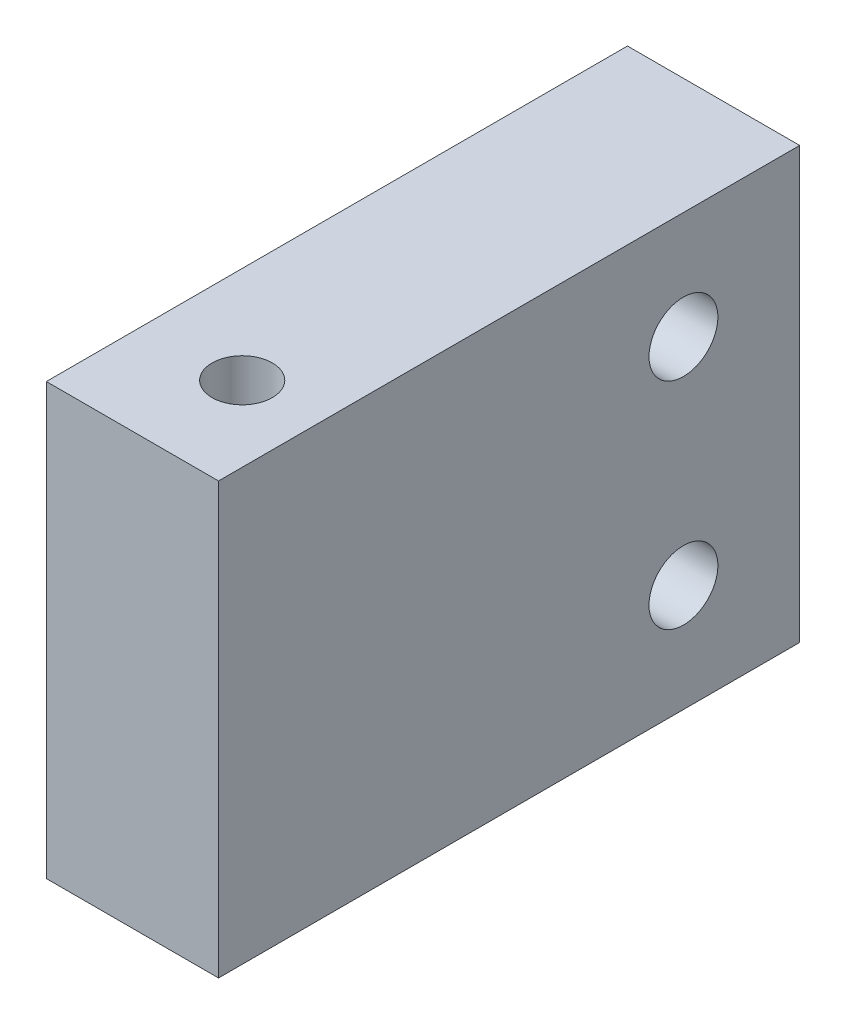
ISO-10303-21;
HEADER;
FILE_DESCRIPTION(('STEP AP214'),'2;1');
FILE_NAME('part.step','',(''),(''),'','','');
FILE_SCHEMA(('AUTOMOTIVE_DESIGN { 1 0 10303 214 1 1 1 1 }'));
ENDSEC;
DATA;
#1=APPLICATION_CONTEXT('core data for automotive mechanical design processes');
#2=APPLICATION_PROTOCOL_DEFINITION('international standard','automotive_design',2000,#1);
#3=PRODUCT_CONTEXT('',#1,'mechanical');
#4=PRODUCT('Part','Part','',(#3));
#5=PRODUCT_RELATED_PRODUCT_CATEGORY('part','',(#4));
#6=PRODUCT_DEFINITION_FORMATION('','',#4);
#7=PRODUCT_DEFINITION_CONTEXT('part definition',#1,'design');
#8=PRODUCT_DEFINITION('design','',#6,#7);
#9=PRODUCT_DEFINITION_SHAPE('','',#8);
#10=(LENGTH_UNIT() NAMED_UNIT(*) SI_UNIT(.MILLI.,.METRE.));
#11=(NAMED_UNIT(*) PLANE_ANGLE_UNIT() SI_UNIT($,.RADIAN.));
#12=(NAMED_UNIT(*) SI_UNIT($,.STERADIAN.) SOLID_ANGLE_UNIT());
#13=UNCERTAINTY_MEASURE_WITH_UNIT(LENGTH_MEASURE(1.E-05),#10,'distance_accuracy_value','');
#14=(GEOMETRIC_REPRESENTATION_CONTEXT(3) GLOBAL_UNCERTAINTY_ASSIGNED_CONTEXT((#13)) GLOBAL_UNIT_ASSIGNED_CONTEXT((#10,
#11,#12)) REPRESENTATION_CONTEXT('',''));
#15=CARTESIAN_POINT('',(0.,0.,0.));
#16=DIRECTION('',(0.,0.,1.));
#17=DIRECTION('',(1.,0.,0.));
#18=AXIS2_PLACEMENT_3D('',#15,#16,#17);
#19=CARTESIAN_POINT('',(0.,25.4,-20.272612439144));
#20=DIRECTION('',(0.,0.,-1.));
#21=DIRECTION('',(-1.,0.,0.));
#22=AXIS2_PLACEMENT_3D('',#19,#20,#21);
#23=PLANE('',#22);
#24=DIRECTION('',(1.,0.,0.));
#25=VECTOR('',#24,1.);
#26=CARTESIAN_POINT('',(0.,0.,-20.272612439144));
#27=LINE('',#26,#25);
#28=CARTESIAN_POINT('',(-10.16,0.,-20.272612439144));
#29=VERTEX_POINT('',#28);
#30=CARTESIAN_POINT('',(0.,0.,-20.272612439144));
#31=VERTEX_POINT('',#30);
#32=EDGE_CURVE('E136',#29,#31,#27,.T.);
#33=ORIENTED_EDGE('',*,*,#32,.T.);
#34=DIRECTION('',(0.,-1.,0.));
#35=VECTOR('',#34,1.);
#36=CARTESIAN_POINT('',(0.,25.4,-20.272612439144));
#37=LINE('',#36,#35);
#38=CARTESIAN_POINT('',(0.,25.4,-20.272612439144));
#39=VERTEX_POINT('',#38);
#40=EDGE_CURVE('E11',#39,#31,#37,.T.);
#41=ORIENTED_EDGE('',*,*,#40,.F.);
#42=DIRECTION('',(1.,0.,0.));
#43=VECTOR('',#42,1.);
#44=CARTESIAN_POINT('',(0.,25.4,-20.272612439144));
#45=LINE('',#44,#43);
#46=CARTESIAN_POINT('',(-10.16,25.4,-20.272612439144));
#47=VERTEX_POINT('',#46);
#48=EDGE_CURVE('E128',#47,#39,#45,.T.);
#49=ORIENTED_EDGE('',*,*,#48,.F.);
#50=DIRECTION('',(0.,-1.,0.));
#51=VECTOR('',#50,1.);
#52=CARTESIAN_POINT('',(-10.16,25.4,-20.272612439144));
#53=LINE('',#52,#51);
#54=EDGE_CURVE('E55',#47,#29,#53,.T.);
#55=ORIENTED_EDGE('',*,*,#54,.T.);
#56=EDGE_LOOP('',(#33,#41,#49,#55));
#57=FACE_BOUND('',#56,.T.);
#58=ADVANCED_FACE('F45',(#57),#23,.F.);
#59=CARTESIAN_POINT('',(0.,25.4,0.));
#60=DIRECTION('',(-1.,0.,0.));
#61=DIRECTION('',(0.,0.,1.));
#62=AXIS2_PLACEMENT_3D('',#59,#60,#61);
#63=PLANE('',#62);
#64=CARTESIAN_POINT('',(0.,6.35,-47.704612439144));
#65=DIRECTION('',(-1.,0.,0.));
#66=DIRECTION('',(0.,0.,1.));
#67=AXIS2_PLACEMENT_3D('',#64,#65,#66);
#68=CIRCLE('',#67,2.032);
#69=CARTESIAN_POINT('',(0.,6.35,-45.672612439144));
#70=VERTEX_POINT('',#69);
#71=EDGE_CURVE('E109',#70,#70,#68,.T.);
#72=ORIENTED_EDGE('',*,*,#71,.T.);
#73=EDGE_LOOP('',(#72));
#74=FACE_BOUND('',#73,.T.);
#75=CARTESIAN_POINT('',(0.,19.05,-47.704612439144));
#76=DIRECTION('',(-1.,0.,0.));
#77=DIRECTION('',(0.,0.,1.));
#78=AXIS2_PLACEMENT_3D('',#75,#76,#77);
#79=CIRCLE('',#78,2.032);
#80=CARTESIAN_POINT('',(0.,19.05,-45.672612439144));
#81=VERTEX_POINT('',#80);
#82=EDGE_CURVE('E116',#81,#81,#79,.T.);
#83=ORIENTED_EDGE('',*,*,#82,.T.);
#84=EDGE_LOOP('',(#83));
#85=FACE_BOUND('',#84,.T.);
#86=DIRECTION('',(0.,0.,-1.));
#87=VECTOR('',#86,1.);
#88=CARTESIAN_POINT('',(0.,0.,0.));
#89=LINE('',#88,#87);
#90=CARTESIAN_POINT('',(0.,0.,-54.562612439144));
#91=VERTEX_POINT('',#90);
#92=EDGE_CURVE('E75',#31,#91,#89,.T.);
#93=ORIENTED_EDGE('',*,*,#92,.T.);
#94=DIRECTION('',(0.,-1.,0.));
#95=VECTOR('',#94,1.);
#96=CARTESIAN_POINT('',(0.,25.4,-54.562612439144));
#97=LINE('',#96,#95);
#98=CARTESIAN_POINT('',(0.,25.4,-54.562612439144));
#99=VERTEX_POINT('',#98);
#100=EDGE_CURVE('E104',#99,#91,#97,.T.);
#101=ORIENTED_EDGE('',*,*,#100,.F.);
#102=DIRECTION('',(0.,0.,-1.));
#103=VECTOR('',#102,1.);
#104=CARTESIAN_POINT('',(0.,25.4,0.));
#105=LINE('',#104,#103);
#106=EDGE_CURVE('E95',#39,#99,#105,.T.);
#107=ORIENTED_EDGE('',*,*,#106,.F.);
#108=ORIENTED_EDGE('',*,*,#40,.T.);
#109=EDGE_LOOP('',(#93,#101,#107,#108));
#110=FACE_BOUND('',#109,.T.);
#111=ADVANCED_FACE('F160',(#74,#85,#110),#63,.F.);
#112=CARTESIAN_POINT('',(-4.445,25.4,-26.114612439144));
#113=DIRECTION('',(0.,-1.,0.));
#114=DIRECTION('',(0.,0.,-1.));
#115=AXIS2_PLACEMENT_3D('',#112,#113,#114);
#116=CYLINDRICAL_SURFACE('',#115,1.77681191348884);
#117=CARTESIAN_POINT('',(-4.445,25.4,-26.114612439144));
#118=DIRECTION('',(0.,1.,0.));
#119=DIRECTION('',(0.,0.,1.));
#120=AXIS2_PLACEMENT_3D('',#117,#118,#119);
#121=CIRCLE('',#120,1.77681191348884);
#122=CARTESIAN_POINT('',(-4.445,25.4,-24.3378005256552));
#123=VERTEX_POINT('',#122);
#124=EDGE_CURVE('E124',#123,#123,#121,.T.);
#125=ORIENTED_EDGE('',*,*,#124,.T.);
#126=EDGE_LOOP('',(#125));
#127=FACE_BOUND('',#126,.T.);
#128=CARTESIAN_POINT('',(-4.445,0.,-26.114612439144));
#129=DIRECTION('',(0.,1.,0.));
#130=DIRECTION('',(0.,0.,1.));
#131=AXIS2_PLACEMENT_3D('',#128,#129,#130);
#132=CIRCLE('',#131,1.77681191348884);
#133=CARTESIAN_POINT('',(-4.445,0.,-24.3378005256552));
#134=VERTEX_POINT('',#133);
#135=EDGE_CURVE('E123',#134,#134,#132,.T.);
#136=ORIENTED_EDGE('',*,*,#135,.F.);
#137=EDGE_LOOP('',(#136));
#138=FACE_BOUND('',#137,.T.);
#139=ADVANCED_FACE('F47',(#127,#138),#116,.F.);
#140=CARTESIAN_POINT('',(-10.16,25.4,0.));
#141=DIRECTION('',(1.,0.,0.));
#142=DIRECTION('',(0.,0.,-1.));
#143=AXIS2_PLACEMENT_3D('',#140,#141,#142);
#144=PLANE('',#143);
#145=CARTESIAN_POINT('',(-10.16,6.35,-47.704612439144));
#146=DIRECTION('',(-1.,0.,0.));
#147=DIRECTION('',(0.,0.,1.));
#148=AXIS2_PLACEMENT_3D('',#145,#146,#147);
#149=CIRCLE('',#148,2.032);
#150=CARTESIAN_POINT('',(-10.16,6.35,-45.672612439144));
#151=VERTEX_POINT('',#150);
#152=EDGE_CURVE('E113',#151,#151,#149,.T.);
#153=ORIENTED_EDGE('',*,*,#152,.F.);
#154=EDGE_LOOP('',(#153));
#155=FACE_BOUND('',#154,.T.);
#156=CARTESIAN_POINT('',(-10.16,19.05,-47.704612439144));
#157=DIRECTION('',(-1.,0.,0.));
#158=DIRECTION('',(0.,0.,1.));
#159=AXIS2_PLACEMENT_3D('',#156,#157,#158);
#160=CIRCLE('',#159,2.032);
#161=CARTESIAN_POINT('',(-10.16,19.05,-45.672612439144));
#162=VERTEX_POINT('',#161);
#163=EDGE_CURVE('E178',#162,#162,#160,.T.);
#164=ORIENTED_EDGE('',*,*,#163,.F.);
#165=EDGE_LOOP('',(#164));
#166=FACE_BOUND('',#165,.T.);
#167=DIRECTION('',(0.,0.,1.));
#168=VECTOR('',#167,1.);
#169=CARTESIAN_POINT('',(-10.16,0.,0.));
#170=LINE('',#169,#168);
#171=CARTESIAN_POINT('',(-10.16,0.,-54.562612439144));
#172=VERTEX_POINT('',#171);
#173=EDGE_CURVE('E79',#172,#29,#170,.T.);
#174=ORIENTED_EDGE('',*,*,#173,.T.);
#175=ORIENTED_EDGE('',*,*,#54,.F.);
#176=DIRECTION('',(0.,0.,1.));
#177=VECTOR('',#176,1.);
#178=CARTESIAN_POINT('',(-10.16,25.4,0.));
#179=LINE('',#178,#177);
#180=CARTESIAN_POINT('',(-10.16,25.4,-54.562612439144));
#181=VERTEX_POINT('',#180);
#182=EDGE_CURVE('E63',#181,#47,#179,.T.);
#183=ORIENTED_EDGE('',*,*,#182,.F.);
#184=DIRECTION('',(0.,1.,0.));
#185=VECTOR('',#184,1.);
#186=CARTESIAN_POINT('',(-10.16,25.4,-54.562612439144));
#187=LINE('',#186,#185);
#188=EDGE_CURVE('E91',#172,#181,#187,.T.);
#189=ORIENTED_EDGE('',*,*,#188,.F.);
#190=EDGE_LOOP('',(#174,#175,#183,#189));
#191=FACE_BOUND('',#190,.T.);
#192=ADVANCED_FACE('F89',(#155,#166,#191),#144,.F.);
#193=CARTESIAN_POINT('',(0.,25.4,0.));
#194=DIRECTION('',(0.,1.,0.));
#195=DIRECTION('',(0.,0.,1.));
#196=AXIS2_PLACEMENT_3D('',#193,#194,#195);
#197=PLANE('',#196);
#198=ORIENTED_EDGE('',*,*,#124,.F.);
#199=EDGE_LOOP('',(#198));
#200=FACE_BOUND('',#199,.T.);
#201=ORIENTED_EDGE('',*,*,#48,.T.);
#202=ORIENTED_EDGE('',*,*,#106,.T.);
#203=DIRECTION('',(1.,0.,0.));
#204=VECTOR('',#203,1.);
#205=CARTESIAN_POINT('',(-10.16,25.4,-54.562612439144));
#206=LINE('',#205,#204);
#207=EDGE_CURVE('E98',#181,#99,#206,.T.);
#208=ORIENTED_EDGE('',*,*,#207,.F.);
#209=ORIENTED_EDGE('',*,*,#182,.T.);
#210=EDGE_LOOP('',(#201,#202,#208,#209));
#211=FACE_BOUND('',#210,.T.);
#212=ADVANCED_FACE('F99',(#200,#211),#197,.T.);
#213=CARTESIAN_POINT('',(0.,0.,0.));
#214=DIRECTION('',(0.,1.,0.));
#215=DIRECTION('',(0.,0.,1.));
#216=AXIS2_PLACEMENT_3D('',#213,#214,#215);
#217=PLANE('',#216);
#218=ORIENTED_EDGE('',*,*,#135,.T.);
#219=EDGE_LOOP('',(#218));
#220=FACE_BOUND('',#219,.T.);
#221=ORIENTED_EDGE('',*,*,#32,.F.);
#222=ORIENTED_EDGE('',*,*,#173,.F.);
#223=DIRECTION('',(-1.,0.,0.));
#224=VECTOR('',#223,1.);
#225=CARTESIAN_POINT('',(-10.16,0.,-54.562612439144));
#226=LINE('',#225,#224);
#227=EDGE_CURVE('E107',#91,#172,#226,.T.);
#228=ORIENTED_EDGE('',*,*,#227,.F.);
#229=ORIENTED_EDGE('',*,*,#92,.F.);
#230=EDGE_LOOP('',(#221,#222,#228,#229));
#231=FACE_BOUND('',#230,.T.);
#232=ADVANCED_FACE('F146',(#220,#231),#217,.F.);
#233=CARTESIAN_POINT('',(0.,0.,-54.562612439144));
#234=DIRECTION('',(0.,0.,1.));
#235=DIRECTION('',(1.,0.,0.));
#236=AXIS2_PLACEMENT_3D('',#233,#234,#235);
#237=PLANE('',#236);
#238=ORIENTED_EDGE('',*,*,#188,.T.);
#239=ORIENTED_EDGE('',*,*,#207,.T.);
#240=ORIENTED_EDGE('',*,*,#100,.T.);
#241=ORIENTED_EDGE('',*,*,#227,.T.);
#242=EDGE_LOOP('',(#238,#239,#240,#241));
#243=FACE_BOUND('',#242,.T.);
#244=ADVANCED_FACE('F106',(#243),#237,.F.);
#245=CARTESIAN_POINT('',(0.,19.05,-47.704612439144));
#246=DIRECTION('',(-1.,0.,0.));
#247=DIRECTION('',(0.,0.,1.));
#248=AXIS2_PLACEMENT_3D('',#245,#246,#247);
#249=CYLINDRICAL_SURFACE('',#248,2.032);
#250=ORIENTED_EDGE('',*,*,#82,.F.);
#251=EDGE_LOOP('',(#250));
#252=FACE_BOUND('',#251,.T.);
#253=ORIENTED_EDGE('',*,*,#163,.T.);
#254=EDGE_LOOP('',(#253));
#255=FACE_BOUND('',#254,.T.);
#256=ADVANCED_FACE('F154',(#252,#255),#249,.F.);
#257=CARTESIAN_POINT('',(0.,6.35,-47.704612439144));
#258=DIRECTION('',(-1.,0.,0.));
#259=DIRECTION('',(0.,0.,1.));
#260=AXIS2_PLACEMENT_3D('',#257,#258,#259);
#261=CYLINDRICAL_SURFACE('',#260,2.032);
#262=ORIENTED_EDGE('',*,*,#71,.F.);
#263=EDGE_LOOP('',(#262));
#264=FACE_BOUND('',#263,.T.);
#265=ORIENTED_EDGE('',*,*,#152,.T.);
#266=EDGE_LOOP('',(#265));
#267=FACE_BOUND('',#266,.T.);
#268=ADVANCED_FACE('F189',(#264,#267),#261,.F.);
#269=CLOSED_SHELL('',(#58,#111,#139,#192,#212,#232,#244,#256,#268));
#270=MANIFOLD_SOLID_BREP('B2',#269);
#271=ADVANCED_BREP_SHAPE_REPRESENTATION('',(#18,#270),#14);
#272=SHAPE_DEFINITION_REPRESENTATION(#9,#271);
ENDSEC;
END-ISO-10303-21;
